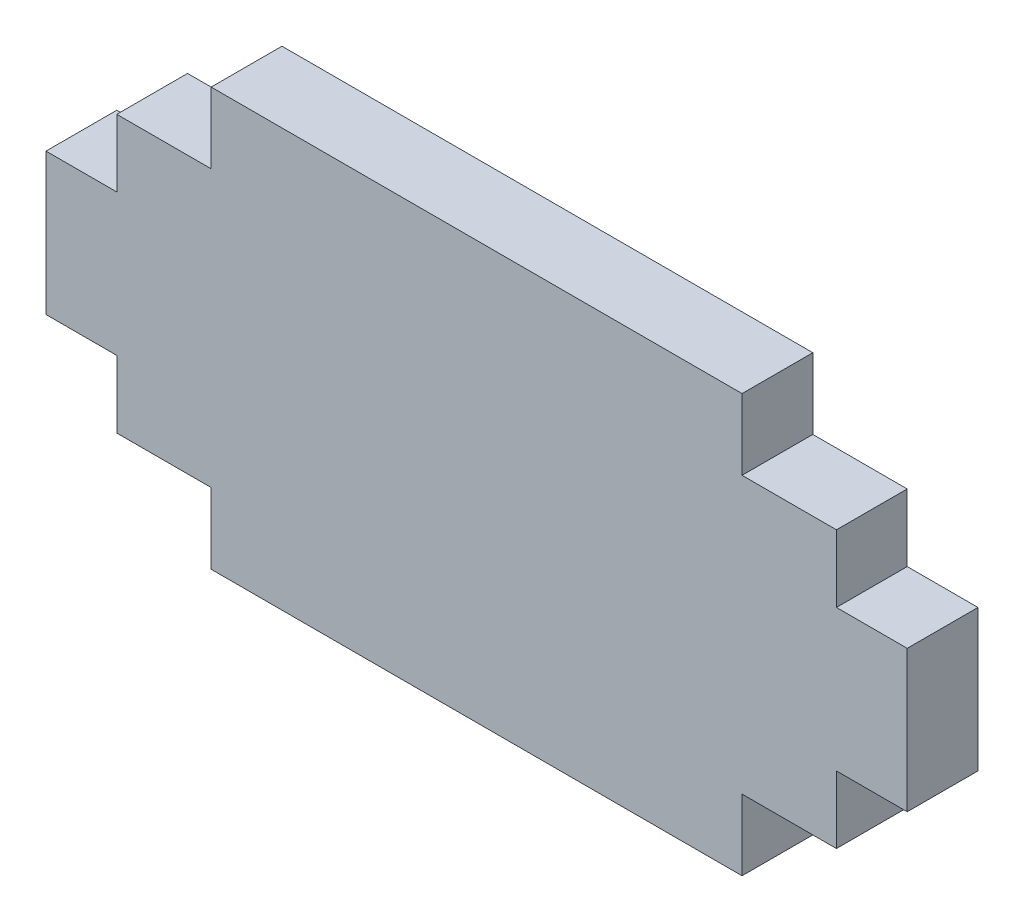
ISO-10303-21;
HEADER;
FILE_DESCRIPTION(('STEP AP214'),'2;1');
FILE_NAME('part.step','',(''),(''),'','','');
FILE_SCHEMA(('AUTOMOTIVE_DESIGN { 1 0 10303 214 1 1 1 1 }'));
ENDSEC;
DATA;
#1=APPLICATION_CONTEXT('core data for automotive mechanical design processes');
#2=APPLICATION_PROTOCOL_DEFINITION('international standard','automotive_design',2000,#1);
#3=PRODUCT_CONTEXT('',#1,'mechanical');
#4=PRODUCT('Part','Part','',(#3));
#5=PRODUCT_RELATED_PRODUCT_CATEGORY('part','',(#4));
#6=PRODUCT_DEFINITION_FORMATION('','',#4);
#7=PRODUCT_DEFINITION_CONTEXT('part definition',#1,'design');
#8=PRODUCT_DEFINITION('design','',#6,#7);
#9=PRODUCT_DEFINITION_SHAPE('','',#8);
#10=(LENGTH_UNIT() NAMED_UNIT(*) SI_UNIT(.MILLI.,.METRE.));
#11=(NAMED_UNIT(*) PLANE_ANGLE_UNIT() SI_UNIT($,.RADIAN.));
#12=(NAMED_UNIT(*) SI_UNIT($,.STERADIAN.) SOLID_ANGLE_UNIT());
#13=UNCERTAINTY_MEASURE_WITH_UNIT(LENGTH_MEASURE(1.E-05),#10,'distance_accuracy_value','');
#14=(GEOMETRIC_REPRESENTATION_CONTEXT(3) GLOBAL_UNCERTAINTY_ASSIGNED_CONTEXT((#13)) GLOBAL_UNIT_ASSIGNED_CONTEXT((#10,
#11,#12)) REPRESENTATION_CONTEXT('',''));
#15=CARTESIAN_POINT('',(0.,0.,0.));
#16=DIRECTION('',(0.,0.,1.));
#17=DIRECTION('',(1.,0.,0.));
#18=AXIS2_PLACEMENT_3D('',#15,#16,#17);
#19=CARTESIAN_POINT('',(0.,-3.,3.));
#20=DIRECTION('',(1.,0.,0.));
#21=DIRECTION('',(0.,0.,-1.));
#22=AXIS2_PLACEMENT_3D('',#19,#20,#21);
#23=PLANE('',#22);
#24=DIRECTION('',(0.,-1.,0.));
#25=VECTOR('',#24,1.);
#26=CARTESIAN_POINT('',(0.,-3.,0.));
#27=LINE('',#26,#25);
#28=CARTESIAN_POINT('',(0.,-3.,0.));
#29=VERTEX_POINT('',#28);
#30=CARTESIAN_POINT('',(0.,-5.85,0.));
#31=VERTEX_POINT('',#30);
#32=EDGE_CURVE('E216',#29,#31,#27,.T.);
#33=ORIENTED_EDGE('',*,*,#32,.T.);
#34=DIRECTION('',(0.,0.,-1.));
#35=VECTOR('',#34,1.);
#36=CARTESIAN_POINT('',(0.,-5.85,3.));
#37=LINE('',#36,#35);
#38=CARTESIAN_POINT('',(0.,-5.85,3.));
#39=VERTEX_POINT('',#38);
#40=EDGE_CURVE('E11',#39,#31,#37,.T.);
#41=ORIENTED_EDGE('',*,*,#40,.F.);
#42=DIRECTION('',(0.,-1.,0.));
#43=VECTOR('',#42,1.);
#44=CARTESIAN_POINT('',(0.,-3.,3.));
#45=LINE('',#44,#43);
#46=CARTESIAN_POINT('',(0.,-3.,3.));
#47=VERTEX_POINT('',#46);
#48=EDGE_CURVE('E254',#47,#39,#45,.T.);
#49=ORIENTED_EDGE('',*,*,#48,.F.);
#50=DIRECTION('',(0.,0.,-1.));
#51=VECTOR('',#50,1.);
#52=CARTESIAN_POINT('',(0.,-3.,3.));
#53=LINE('',#52,#51);
#54=EDGE_CURVE('E212',#47,#29,#53,.T.);
#55=ORIENTED_EDGE('',*,*,#54,.T.);
#56=EDGE_LOOP('',(#33,#41,#49,#55));
#57=FACE_BOUND('',#56,.T.);
#58=ADVANCED_FACE('F47',(#57),#23,.F.);
#59=CARTESIAN_POINT('',(0.,-5.85,3.));
#60=DIRECTION('',(0.,1.,0.));
#61=DIRECTION('',(0.,0.,1.));
#62=AXIS2_PLACEMENT_3D('',#59,#60,#61);
#63=PLANE('',#62);
#64=DIRECTION('',(1.,0.,0.));
#65=VECTOR('',#64,1.);
#66=CARTESIAN_POINT('',(0.,-5.85,0.));
#67=LINE('',#66,#65);
#68=CARTESIAN_POINT('',(4.,-5.85,0.));
#69=VERTEX_POINT('',#68);
#70=EDGE_CURVE('E219',#31,#69,#67,.T.);
#71=ORIENTED_EDGE('',*,*,#70,.T.);
#72=DIRECTION('',(0.,0.,-1.));
#73=VECTOR('',#72,1.);
#74=CARTESIAN_POINT('',(4.,-5.85,3.));
#75=LINE('',#74,#73);
#76=CARTESIAN_POINT('',(4.,-5.85,3.));
#77=VERTEX_POINT('',#76);
#78=EDGE_CURVE('E56',#77,#69,#75,.T.);
#79=ORIENTED_EDGE('',*,*,#78,.F.);
#80=DIRECTION('',(1.,0.,0.));
#81=VECTOR('',#80,1.);
#82=CARTESIAN_POINT('',(0.,-5.85,3.));
#83=LINE('',#82,#81);
#84=EDGE_CURVE('E143',#39,#77,#83,.T.);
#85=ORIENTED_EDGE('',*,*,#84,.F.);
#86=ORIENTED_EDGE('',*,*,#40,.T.);
#87=EDGE_LOOP('',(#71,#79,#85,#86));
#88=FACE_BOUND('',#87,.T.);
#89=ADVANCED_FACE('F372',(#88),#63,.F.);
#90=CARTESIAN_POINT('',(4.,-5.85,3.));
#91=DIRECTION('',(1.,0.,0.));
#92=DIRECTION('',(0.,0.,-1.));
#93=AXIS2_PLACEMENT_3D('',#90,#91,#92);
#94=PLANE('',#93);
#95=DIRECTION('',(0.,-1.,0.));
#96=VECTOR('',#95,1.);
#97=CARTESIAN_POINT('',(4.,-5.85,0.));
#98=LINE('',#97,#96);
#99=CARTESIAN_POINT('',(4.,-8.85,0.));
#100=VERTEX_POINT('',#99);
#101=EDGE_CURVE('E221',#69,#100,#98,.T.);
#102=ORIENTED_EDGE('',*,*,#101,.T.);
#103=DIRECTION('',(0.,0.,-1.));
#104=VECTOR('',#103,1.);
#105=CARTESIAN_POINT('',(4.,-8.85,3.));
#106=LINE('',#105,#104);
#107=CARTESIAN_POINT('',(4.,-8.85,3.));
#108=VERTEX_POINT('',#107);
#109=EDGE_CURVE('E297',#108,#100,#106,.T.);
#110=ORIENTED_EDGE('',*,*,#109,.F.);
#111=DIRECTION('',(0.,-1.,0.));
#112=VECTOR('',#111,1.);
#113=CARTESIAN_POINT('',(4.,-5.85,3.));
#114=LINE('',#113,#112);
#115=EDGE_CURVE('E305',#77,#108,#114,.T.);
#116=ORIENTED_EDGE('',*,*,#115,.F.);
#117=ORIENTED_EDGE('',*,*,#78,.T.);
#118=EDGE_LOOP('',(#102,#110,#116,#117));
#119=FACE_BOUND('',#118,.T.);
#120=ADVANCED_FACE('F303',(#119),#94,.F.);
#121=CARTESIAN_POINT('',(4.,-8.85,3.));
#122=DIRECTION('',(0.,1.,0.));
#123=DIRECTION('',(0.,0.,1.));
#124=AXIS2_PLACEMENT_3D('',#121,#122,#123);
#125=PLANE('',#124);
#126=DIRECTION('',(1.,0.,0.));
#127=VECTOR('',#126,1.);
#128=CARTESIAN_POINT('',(4.,-8.85,0.));
#129=LINE('',#128,#127);
#130=CARTESIAN_POINT('',(26.5,-8.85,0.));
#131=VERTEX_POINT('',#130);
#132=EDGE_CURVE('E223',#100,#131,#129,.T.);
#133=ORIENTED_EDGE('',*,*,#132,.T.);
#134=DIRECTION('',(0.,0.,-1.));
#135=VECTOR('',#134,1.);
#136=CARTESIAN_POINT('',(26.5,-8.85,3.));
#137=LINE('',#136,#135);
#138=CARTESIAN_POINT('',(26.5,-8.85,3.));
#139=VERTEX_POINT('',#138);
#140=EDGE_CURVE('E294',#139,#131,#137,.T.);
#141=ORIENTED_EDGE('',*,*,#140,.F.);
#142=DIRECTION('',(1.,0.,0.));
#143=VECTOR('',#142,1.);
#144=CARTESIAN_POINT('',(4.,-8.85,3.));
#145=LINE('',#144,#143);
#146=EDGE_CURVE('E323',#108,#139,#145,.T.);
#147=ORIENTED_EDGE('',*,*,#146,.F.);
#148=ORIENTED_EDGE('',*,*,#109,.T.);
#149=EDGE_LOOP('',(#133,#141,#147,#148));
#150=FACE_BOUND('',#149,.T.);
#151=ADVANCED_FACE('F314',(#150),#125,.F.);
#152=CARTESIAN_POINT('',(26.5,-8.85,3.));
#153=DIRECTION('',(-1.,0.,0.));
#154=DIRECTION('',(0.,0.,1.));
#155=AXIS2_PLACEMENT_3D('',#152,#153,#154);
#156=PLANE('',#155);
#157=DIRECTION('',(0.,1.,0.));
#158=VECTOR('',#157,1.);
#159=CARTESIAN_POINT('',(26.5,-8.85,0.));
#160=LINE('',#159,#158);
#161=CARTESIAN_POINT('',(26.5,-5.85,0.));
#162=VERTEX_POINT('',#161);
#163=EDGE_CURVE('E225',#131,#162,#160,.T.);
#164=ORIENTED_EDGE('',*,*,#163,.T.);
#165=DIRECTION('',(0.,0.,-1.));
#166=VECTOR('',#165,1.);
#167=CARTESIAN_POINT('',(26.5,-5.85,3.));
#168=LINE('',#167,#166);
#169=CARTESIAN_POINT('',(26.5,-5.85,3.));
#170=VERTEX_POINT('',#169);
#171=EDGE_CURVE('E291',#170,#162,#168,.T.);
#172=ORIENTED_EDGE('',*,*,#171,.F.);
#173=DIRECTION('',(0.,1.,0.));
#174=VECTOR('',#173,1.);
#175=CARTESIAN_POINT('',(26.5,-8.85,3.));
#176=LINE('',#175,#174);
#177=EDGE_CURVE('E320',#139,#170,#176,.T.);
#178=ORIENTED_EDGE('',*,*,#177,.F.);
#179=ORIENTED_EDGE('',*,*,#140,.T.);
#180=EDGE_LOOP('',(#164,#172,#178,#179));
#181=FACE_BOUND('',#180,.T.);
#182=ADVANCED_FACE('F318',(#181),#156,.F.);
#183=CARTESIAN_POINT('',(26.5,-5.85,3.));
#184=DIRECTION('',(0.,1.,0.));
#185=DIRECTION('',(0.,0.,1.));
#186=AXIS2_PLACEMENT_3D('',#183,#184,#185);
#187=PLANE('',#186);
#188=DIRECTION('',(1.,0.,0.));
#189=VECTOR('',#188,1.);
#190=CARTESIAN_POINT('',(26.5,-5.85,0.));
#191=LINE('',#190,#189);
#192=CARTESIAN_POINT('',(30.5,-5.85,0.));
#193=VERTEX_POINT('',#192);
#194=EDGE_CURVE('E227',#162,#193,#191,.T.);
#195=ORIENTED_EDGE('',*,*,#194,.T.);
#196=DIRECTION('',(0.,0.,-1.));
#197=VECTOR('',#196,1.);
#198=CARTESIAN_POINT('',(30.5,-5.85,3.));
#199=LINE('',#198,#197);
#200=CARTESIAN_POINT('',(30.5,-5.85,3.));
#201=VERTEX_POINT('',#200);
#202=EDGE_CURVE('E288',#201,#193,#199,.T.);
#203=ORIENTED_EDGE('',*,*,#202,.F.);
#204=DIRECTION('',(1.,0.,0.));
#205=VECTOR('',#204,1.);
#206=CARTESIAN_POINT('',(26.5,-5.85,3.));
#207=LINE('',#206,#205);
#208=EDGE_CURVE('E322',#170,#201,#207,.T.);
#209=ORIENTED_EDGE('',*,*,#208,.F.);
#210=ORIENTED_EDGE('',*,*,#171,.T.);
#211=EDGE_LOOP('',(#195,#203,#209,#210));
#212=FACE_BOUND('',#211,.T.);
#213=ADVANCED_FACE('F388',(#212),#187,.F.);
#214=CARTESIAN_POINT('',(30.5,-5.85,3.));
#215=DIRECTION('',(-1.,0.,0.));
#216=DIRECTION('',(0.,0.,1.));
#217=AXIS2_PLACEMENT_3D('',#214,#215,#216);
#218=PLANE('',#217);
#219=DIRECTION('',(0.,1.,0.));
#220=VECTOR('',#219,1.);
#221=CARTESIAN_POINT('',(30.5,-5.85,0.));
#222=LINE('',#221,#220);
#223=CARTESIAN_POINT('',(30.5,-3.,0.));
#224=VERTEX_POINT('',#223);
#225=EDGE_CURVE('E229',#193,#224,#222,.T.);
#226=ORIENTED_EDGE('',*,*,#225,.T.);
#227=DIRECTION('',(0.,0.,-1.));
#228=VECTOR('',#227,1.);
#229=CARTESIAN_POINT('',(30.5,-3.,3.));
#230=LINE('',#229,#228);
#231=CARTESIAN_POINT('',(30.5,-3.,3.));
#232=VERTEX_POINT('',#231);
#233=EDGE_CURVE('E285',#232,#224,#230,.T.);
#234=ORIENTED_EDGE('',*,*,#233,.F.);
#235=DIRECTION('',(0.,1.,0.));
#236=VECTOR('',#235,1.);
#237=CARTESIAN_POINT('',(30.5,-5.85,3.));
#238=LINE('',#237,#236);
#239=EDGE_CURVE('E325',#201,#232,#238,.T.);
#240=ORIENTED_EDGE('',*,*,#239,.F.);
#241=ORIENTED_EDGE('',*,*,#202,.T.);
#242=EDGE_LOOP('',(#226,#234,#240,#241));
#243=FACE_BOUND('',#242,.T.);
#244=ADVANCED_FACE('F392',(#243),#218,.F.);
#245=CARTESIAN_POINT('',(30.5,-3.,3.));
#246=DIRECTION('',(0.,1.,0.));
#247=DIRECTION('',(0.,0.,1.));
#248=AXIS2_PLACEMENT_3D('',#245,#246,#247);
#249=PLANE('',#248);
#250=DIRECTION('',(1.,0.,0.));
#251=VECTOR('',#250,1.);
#252=CARTESIAN_POINT('',(30.5,-3.,0.));
#253=LINE('',#252,#251);
#254=CARTESIAN_POINT('',(33.5,-3.,0.));
#255=VERTEX_POINT('',#254);
#256=EDGE_CURVE('E231',#224,#255,#253,.T.);
#257=ORIENTED_EDGE('',*,*,#256,.T.);
#258=DIRECTION('',(0.,0.,-1.));
#259=VECTOR('',#258,1.);
#260=CARTESIAN_POINT('',(33.5,-3.,3.));
#261=LINE('',#260,#259);
#262=CARTESIAN_POINT('',(33.5,-3.,3.));
#263=VERTEX_POINT('',#262);
#264=EDGE_CURVE('E282',#263,#255,#261,.T.);
#265=ORIENTED_EDGE('',*,*,#264,.F.);
#266=DIRECTION('',(1.,0.,0.));
#267=VECTOR('',#266,1.);
#268=CARTESIAN_POINT('',(30.5,-3.,3.));
#269=LINE('',#268,#267);
#270=EDGE_CURVE('E331',#232,#263,#269,.T.);
#271=ORIENTED_EDGE('',*,*,#270,.F.);
#272=ORIENTED_EDGE('',*,*,#233,.T.);
#273=EDGE_LOOP('',(#257,#265,#271,#272));
#274=FACE_BOUND('',#273,.T.);
#275=ADVANCED_FACE('F397',(#274),#249,.F.);
#276=CARTESIAN_POINT('',(33.5,-3.,3.));
#277=DIRECTION('',(-1.,0.,0.));
#278=DIRECTION('',(0.,0.,1.));
#279=AXIS2_PLACEMENT_3D('',#276,#277,#278);
#280=PLANE('',#279);
#281=DIRECTION('',(0.,1.,0.));
#282=VECTOR('',#281,1.);
#283=CARTESIAN_POINT('',(33.5,-3.,0.));
#284=LINE('',#283,#282);
#285=CARTESIAN_POINT('',(33.5,3.,0.));
#286=VERTEX_POINT('',#285);
#287=EDGE_CURVE('E233',#255,#286,#284,.T.);
#288=ORIENTED_EDGE('',*,*,#287,.T.);
#289=DIRECTION('',(0.,0.,-1.));
#290=VECTOR('',#289,1.);
#291=CARTESIAN_POINT('',(33.5,3.,3.));
#292=LINE('',#291,#290);
#293=CARTESIAN_POINT('',(33.5,3.,3.));
#294=VERTEX_POINT('',#293);
#295=EDGE_CURVE('E279',#294,#286,#292,.T.);
#296=ORIENTED_EDGE('',*,*,#295,.F.);
#297=DIRECTION('',(0.,1.,0.));
#298=VECTOR('',#297,1.);
#299=CARTESIAN_POINT('',(33.5,-3.,3.));
#300=LINE('',#299,#298);
#301=EDGE_CURVE('E333',#263,#294,#300,.T.);
#302=ORIENTED_EDGE('',*,*,#301,.F.);
#303=ORIENTED_EDGE('',*,*,#264,.T.);
#304=EDGE_LOOP('',(#288,#296,#302,#303));
#305=FACE_BOUND('',#304,.T.);
#306=ADVANCED_FACE('F402',(#305),#280,.F.);
#307=CARTESIAN_POINT('',(33.5,3.,3.));
#308=DIRECTION('',(0.,-1.,0.));
#309=DIRECTION('',(0.,0.,-1.));
#310=AXIS2_PLACEMENT_3D('',#307,#308,#309);
#311=PLANE('',#310);
#312=DIRECTION('',(-1.,0.,0.));
#313=VECTOR('',#312,1.);
#314=CARTESIAN_POINT('',(33.5,3.,0.));
#315=LINE('',#314,#313);
#316=CARTESIAN_POINT('',(30.5,3.,0.));
#317=VERTEX_POINT('',#316);
#318=EDGE_CURVE('E235',#286,#317,#315,.T.);
#319=ORIENTED_EDGE('',*,*,#318,.T.);
#320=DIRECTION('',(0.,0.,-1.));
#321=VECTOR('',#320,1.);
#322=CARTESIAN_POINT('',(30.5,3.,3.));
#323=LINE('',#322,#321);
#324=CARTESIAN_POINT('',(30.5,3.,3.));
#325=VERTEX_POINT('',#324);
#326=EDGE_CURVE('E276',#325,#317,#323,.T.);
#327=ORIENTED_EDGE('',*,*,#326,.F.);
#328=DIRECTION('',(-1.,0.,0.));
#329=VECTOR('',#328,1.);
#330=CARTESIAN_POINT('',(33.5,3.,3.));
#331=LINE('',#330,#329);
#332=EDGE_CURVE('E335',#294,#325,#331,.T.);
#333=ORIENTED_EDGE('',*,*,#332,.F.);
#334=ORIENTED_EDGE('',*,*,#295,.T.);
#335=EDGE_LOOP('',(#319,#327,#333,#334));
#336=FACE_BOUND('',#335,.T.);
#337=ADVANCED_FACE('F407',(#336),#311,.F.);
#338=CARTESIAN_POINT('',(30.5,3.,3.));
#339=DIRECTION('',(-1.,0.,0.));
#340=DIRECTION('',(0.,0.,1.));
#341=AXIS2_PLACEMENT_3D('',#338,#339,#340);
#342=PLANE('',#341);
#343=DIRECTION('',(0.,1.,0.));
#344=VECTOR('',#343,1.);
#345=CARTESIAN_POINT('',(30.5,3.,0.));
#346=LINE('',#345,#344);
#347=CARTESIAN_POINT('',(30.5,5.85,0.));
#348=VERTEX_POINT('',#347);
#349=EDGE_CURVE('E237',#317,#348,#346,.T.);
#350=ORIENTED_EDGE('',*,*,#349,.T.);
#351=DIRECTION('',(0.,0.,-1.));
#352=VECTOR('',#351,1.);
#353=CARTESIAN_POINT('',(30.5,5.85,3.));
#354=LINE('',#353,#352);
#355=CARTESIAN_POINT('',(30.5,5.85,3.));
#356=VERTEX_POINT('',#355);
#357=EDGE_CURVE('E273',#356,#348,#354,.T.);
#358=ORIENTED_EDGE('',*,*,#357,.F.);
#359=DIRECTION('',(0.,1.,0.));
#360=VECTOR('',#359,1.);
#361=CARTESIAN_POINT('',(30.5,3.,3.));
#362=LINE('',#361,#360);
#363=EDGE_CURVE('E337',#325,#356,#362,.T.);
#364=ORIENTED_EDGE('',*,*,#363,.F.);
#365=ORIENTED_EDGE('',*,*,#326,.T.);
#366=EDGE_LOOP('',(#350,#358,#364,#365));
#367=FACE_BOUND('',#366,.T.);
#368=ADVANCED_FACE('F412',(#367),#342,.F.);
#369=CARTESIAN_POINT('',(30.5,5.85,3.));
#370=DIRECTION('',(0.,-1.,0.));
#371=DIRECTION('',(0.,0.,-1.));
#372=AXIS2_PLACEMENT_3D('',#369,#370,#371);
#373=PLANE('',#372);
#374=DIRECTION('',(-1.,0.,0.));
#375=VECTOR('',#374,1.);
#376=CARTESIAN_POINT('',(30.5,5.85,0.));
#377=LINE('',#376,#375);
#378=CARTESIAN_POINT('',(26.5,5.85,0.));
#379=VERTEX_POINT('',#378);
#380=EDGE_CURVE('E239',#348,#379,#377,.T.);
#381=ORIENTED_EDGE('',*,*,#380,.T.);
#382=DIRECTION('',(0.,0.,-1.));
#383=VECTOR('',#382,1.);
#384=CARTESIAN_POINT('',(26.5,5.85,3.));
#385=LINE('',#384,#383);
#386=CARTESIAN_POINT('',(26.5,5.85,3.));
#387=VERTEX_POINT('',#386);
#388=EDGE_CURVE('E270',#387,#379,#385,.T.);
#389=ORIENTED_EDGE('',*,*,#388,.F.);
#390=DIRECTION('',(-1.,0.,0.));
#391=VECTOR('',#390,1.);
#392=CARTESIAN_POINT('',(30.5,5.85,3.));
#393=LINE('',#392,#391);
#394=EDGE_CURVE('E339',#356,#387,#393,.T.);
#395=ORIENTED_EDGE('',*,*,#394,.F.);
#396=ORIENTED_EDGE('',*,*,#357,.T.);
#397=EDGE_LOOP('',(#381,#389,#395,#396));
#398=FACE_BOUND('',#397,.T.);
#399=ADVANCED_FACE('F417',(#398),#373,.F.);
#400=CARTESIAN_POINT('',(26.5,5.85,3.));
#401=DIRECTION('',(-1.,0.,0.));
#402=DIRECTION('',(0.,0.,1.));
#403=AXIS2_PLACEMENT_3D('',#400,#401,#402);
#404=PLANE('',#403);
#405=DIRECTION('',(0.,1.,0.));
#406=VECTOR('',#405,1.);
#407=CARTESIAN_POINT('',(26.5,5.85,0.));
#408=LINE('',#407,#406);
#409=CARTESIAN_POINT('',(26.5,8.85,0.));
#410=VERTEX_POINT('',#409);
#411=EDGE_CURVE('E241',#379,#410,#408,.T.);
#412=ORIENTED_EDGE('',*,*,#411,.T.);
#413=DIRECTION('',(0.,0.,-1.));
#414=VECTOR('',#413,1.);
#415=CARTESIAN_POINT('',(26.5,8.85,3.));
#416=LINE('',#415,#414);
#417=CARTESIAN_POINT('',(26.5,8.85,3.));
#418=VERTEX_POINT('',#417);
#419=EDGE_CURVE('E267',#418,#410,#416,.T.);
#420=ORIENTED_EDGE('',*,*,#419,.F.);
#421=DIRECTION('',(0.,1.,0.));
#422=VECTOR('',#421,1.);
#423=CARTESIAN_POINT('',(26.5,5.85,3.));
#424=LINE('',#423,#422);
#425=EDGE_CURVE('E341',#387,#418,#424,.T.);
#426=ORIENTED_EDGE('',*,*,#425,.F.);
#427=ORIENTED_EDGE('',*,*,#388,.T.);
#428=EDGE_LOOP('',(#412,#420,#426,#427));
#429=FACE_BOUND('',#428,.T.);
#430=ADVANCED_FACE('F422',(#429),#404,.F.);
#431=CARTESIAN_POINT('',(26.5,8.85,3.));
#432=DIRECTION('',(0.,-1.,0.));
#433=DIRECTION('',(0.,0.,-1.));
#434=AXIS2_PLACEMENT_3D('',#431,#432,#433);
#435=PLANE('',#434);
#436=DIRECTION('',(-1.,0.,0.));
#437=VECTOR('',#436,1.);
#438=CARTESIAN_POINT('',(26.5,8.85,0.));
#439=LINE('',#438,#437);
#440=CARTESIAN_POINT('',(4.,8.85,0.));
#441=VERTEX_POINT('',#440);
#442=EDGE_CURVE('E243',#410,#441,#439,.T.);
#443=ORIENTED_EDGE('',*,*,#442,.T.);
#444=DIRECTION('',(0.,0.,-1.));
#445=VECTOR('',#444,1.);
#446=CARTESIAN_POINT('',(4.,8.85,3.));
#447=LINE('',#446,#445);
#448=CARTESIAN_POINT('',(4.,8.85,3.));
#449=VERTEX_POINT('',#448);
#450=EDGE_CURVE('E264',#449,#441,#447,.T.);
#451=ORIENTED_EDGE('',*,*,#450,.F.);
#452=DIRECTION('',(-1.,0.,0.));
#453=VECTOR('',#452,1.);
#454=CARTESIAN_POINT('',(26.5,8.85,3.));
#455=LINE('',#454,#453);
#456=EDGE_CURVE('E343',#418,#449,#455,.T.);
#457=ORIENTED_EDGE('',*,*,#456,.F.);
#458=ORIENTED_EDGE('',*,*,#419,.T.);
#459=EDGE_LOOP('',(#443,#451,#457,#458));
#460=FACE_BOUND('',#459,.T.);
#461=ADVANCED_FACE('F427',(#460),#435,.F.);
#462=CARTESIAN_POINT('',(4.,8.85,3.));
#463=DIRECTION('',(1.,0.,0.));
#464=DIRECTION('',(0.,0.,-1.));
#465=AXIS2_PLACEMENT_3D('',#462,#463,#464);
#466=PLANE('',#465);
#467=DIRECTION('',(0.,-1.,0.));
#468=VECTOR('',#467,1.);
#469=CARTESIAN_POINT('',(4.,8.85,0.));
#470=LINE('',#469,#468);
#471=CARTESIAN_POINT('',(4.,5.85,0.));
#472=VERTEX_POINT('',#471);
#473=EDGE_CURVE('E245',#441,#472,#470,.T.);
#474=ORIENTED_EDGE('',*,*,#473,.T.);
#475=DIRECTION('',(0.,0.,-1.));
#476=VECTOR('',#475,1.);
#477=CARTESIAN_POINT('',(4.,5.85,3.));
#478=LINE('',#477,#476);
#479=CARTESIAN_POINT('',(4.,5.85,3.));
#480=VERTEX_POINT('',#479);
#481=EDGE_CURVE('E261',#480,#472,#478,.T.);
#482=ORIENTED_EDGE('',*,*,#481,.F.);
#483=DIRECTION('',(0.,-1.,0.));
#484=VECTOR('',#483,1.);
#485=CARTESIAN_POINT('',(4.,8.85,3.));
#486=LINE('',#485,#484);
#487=EDGE_CURVE('E345',#449,#480,#486,.T.);
#488=ORIENTED_EDGE('',*,*,#487,.F.);
#489=ORIENTED_EDGE('',*,*,#450,.T.);
#490=EDGE_LOOP('',(#474,#482,#488,#489));
#491=FACE_BOUND('',#490,.T.);
#492=ADVANCED_FACE('F432',(#491),#466,.F.);
#493=CARTESIAN_POINT('',(4.,5.85,3.));
#494=DIRECTION('',(0.,-1.,0.));
#495=DIRECTION('',(0.,0.,-1.));
#496=AXIS2_PLACEMENT_3D('',#493,#494,#495);
#497=PLANE('',#496);
#498=DIRECTION('',(-1.,0.,0.));
#499=VECTOR('',#498,1.);
#500=CARTESIAN_POINT('',(4.,5.85,0.));
#501=LINE('',#500,#499);
#502=CARTESIAN_POINT('',(0.,5.85,0.));
#503=VERTEX_POINT('',#502);
#504=EDGE_CURVE('E247',#472,#503,#501,.T.);
#505=ORIENTED_EDGE('',*,*,#504,.T.);
#506=DIRECTION('',(0.,0.,-1.));
#507=VECTOR('',#506,1.);
#508=CARTESIAN_POINT('',(0.,5.85,3.));
#509=LINE('',#508,#507);
#510=CARTESIAN_POINT('',(0.,5.85,3.));
#511=VERTEX_POINT('',#510);
#512=EDGE_CURVE('E258',#511,#503,#509,.T.);
#513=ORIENTED_EDGE('',*,*,#512,.F.);
#514=DIRECTION('',(-1.,0.,0.));
#515=VECTOR('',#514,1.);
#516=CARTESIAN_POINT('',(4.,5.85,3.));
#517=LINE('',#516,#515);
#518=EDGE_CURVE('E347',#480,#511,#517,.T.);
#519=ORIENTED_EDGE('',*,*,#518,.F.);
#520=ORIENTED_EDGE('',*,*,#481,.T.);
#521=EDGE_LOOP('',(#505,#513,#519,#520));
#522=FACE_BOUND('',#521,.T.);
#523=ADVANCED_FACE('F353',(#522),#497,.F.);
#524=CARTESIAN_POINT('',(0.,5.85,3.));
#525=DIRECTION('',(1.,0.,0.));
#526=DIRECTION('',(0.,0.,-1.));
#527=AXIS2_PLACEMENT_3D('',#524,#525,#526);
#528=PLANE('',#527);
#529=DIRECTION('',(0.,-1.,0.));
#530=VECTOR('',#529,1.);
#531=CARTESIAN_POINT('',(0.,5.85,0.));
#532=LINE('',#531,#530);
#533=CARTESIAN_POINT('',(0.,3.,0.));
#534=VERTEX_POINT('',#533);
#535=EDGE_CURVE('E249',#503,#534,#532,.T.);
#536=ORIENTED_EDGE('',*,*,#535,.T.);
#537=DIRECTION('',(0.,0.,-1.));
#538=VECTOR('',#537,1.);
#539=CARTESIAN_POINT('',(0.,3.,3.));
#540=LINE('',#539,#538);
#541=CARTESIAN_POINT('',(0.,3.,3.));
#542=VERTEX_POINT('',#541);
#543=EDGE_CURVE('E207',#542,#534,#540,.T.);
#544=ORIENTED_EDGE('',*,*,#543,.F.);
#545=DIRECTION('',(0.,-1.,0.));
#546=VECTOR('',#545,1.);
#547=CARTESIAN_POINT('',(0.,5.85,3.));
#548=LINE('',#547,#546);
#549=EDGE_CURVE('E198',#511,#542,#548,.T.);
#550=ORIENTED_EDGE('',*,*,#549,.F.);
#551=ORIENTED_EDGE('',*,*,#512,.T.);
#552=EDGE_LOOP('',(#536,#544,#550,#551));
#553=FACE_BOUND('',#552,.T.);
#554=ADVANCED_FACE('F357',(#553),#528,.F.);
#555=CARTESIAN_POINT('',(0.,3.,3.));
#556=DIRECTION('',(0.,-1.,0.));
#557=DIRECTION('',(0.,0.,-1.));
#558=AXIS2_PLACEMENT_3D('',#555,#556,#557);
#559=PLANE('',#558);
#560=DIRECTION('',(-1.,0.,0.));
#561=VECTOR('',#560,1.);
#562=CARTESIAN_POINT('',(0.,3.,0.));
#563=LINE('',#562,#561);
#564=CARTESIAN_POINT('',(-3.,3.,0.));
#565=VERTEX_POINT('',#564);
#566=EDGE_CURVE('E206',#534,#565,#563,.T.);
#567=ORIENTED_EDGE('',*,*,#566,.T.);
#568=DIRECTION('',(0.,0.,-1.));
#569=VECTOR('',#568,1.);
#570=CARTESIAN_POINT('',(-3.,3.,3.));
#571=LINE('',#570,#569);
#572=CARTESIAN_POINT('',(-3.,3.,3.));
#573=VERTEX_POINT('',#572);
#574=EDGE_CURVE('E203',#573,#565,#571,.T.);
#575=ORIENTED_EDGE('',*,*,#574,.F.);
#576=DIRECTION('',(-1.,0.,0.));
#577=VECTOR('',#576,1.);
#578=CARTESIAN_POINT('',(0.,3.,3.));
#579=LINE('',#578,#577);
#580=EDGE_CURVE('E192',#542,#573,#579,.T.);
#581=ORIENTED_EDGE('',*,*,#580,.F.);
#582=ORIENTED_EDGE('',*,*,#543,.T.);
#583=EDGE_LOOP('',(#567,#575,#581,#582));
#584=FACE_BOUND('',#583,.T.);
#585=ADVANCED_FACE('F204',(#584),#559,.F.);
#586=CARTESIAN_POINT('',(-3.,3.,3.));
#587=DIRECTION('',(1.,0.,0.));
#588=DIRECTION('',(0.,0.,-1.));
#589=AXIS2_PLACEMENT_3D('',#586,#587,#588);
#590=PLANE('',#589);
#591=DIRECTION('',(0.,-1.,0.));
#592=VECTOR('',#591,1.);
#593=CARTESIAN_POINT('',(-3.,3.,0.));
#594=LINE('',#593,#592);
#595=CARTESIAN_POINT('',(-3.,-3.,0.));
#596=VERTEX_POINT('',#595);
#597=EDGE_CURVE('E129',#565,#596,#594,.T.);
#598=ORIENTED_EDGE('',*,*,#597,.T.);
#599=DIRECTION('',(0.,0.,-1.));
#600=VECTOR('',#599,1.);
#601=CARTESIAN_POINT('',(-3.,-3.,3.));
#602=LINE('',#601,#600);
#603=CARTESIAN_POINT('',(-3.,-3.,3.));
#604=VERTEX_POINT('',#603);
#605=EDGE_CURVE('E208',#604,#596,#602,.T.);
#606=ORIENTED_EDGE('',*,*,#605,.F.);
#607=DIRECTION('',(0.,-1.,0.));
#608=VECTOR('',#607,1.);
#609=CARTESIAN_POINT('',(-3.,3.,3.));
#610=LINE('',#609,#608);
#611=EDGE_CURVE('E196',#573,#604,#610,.T.);
#612=ORIENTED_EDGE('',*,*,#611,.F.);
#613=ORIENTED_EDGE('',*,*,#574,.T.);
#614=EDGE_LOOP('',(#598,#606,#612,#613));
#615=FACE_BOUND('',#614,.T.);
#616=ADVANCED_FACE('F210',(#615),#590,.F.);
#617=CARTESIAN_POINT('',(-3.,-3.,3.));
#618=DIRECTION('',(0.,1.,0.));
#619=DIRECTION('',(0.,0.,1.));
#620=AXIS2_PLACEMENT_3D('',#617,#618,#619);
#621=PLANE('',#620);
#622=DIRECTION('',(1.,0.,0.));
#623=VECTOR('',#622,1.);
#624=CARTESIAN_POINT('',(-3.,-3.,0.));
#625=LINE('',#624,#623);
#626=EDGE_CURVE('E135',#596,#29,#625,.T.);
#627=ORIENTED_EDGE('',*,*,#626,.T.);
#628=ORIENTED_EDGE('',*,*,#54,.F.);
#629=DIRECTION('',(1.,0.,0.));
#630=VECTOR('',#629,1.);
#631=CARTESIAN_POINT('',(-3.,-3.,3.));
#632=LINE('',#631,#630);
#633=EDGE_CURVE('E64',#604,#47,#632,.T.);
#634=ORIENTED_EDGE('',*,*,#633,.F.);
#635=ORIENTED_EDGE('',*,*,#605,.T.);
#636=EDGE_LOOP('',(#627,#628,#634,#635));
#637=FACE_BOUND('',#636,.T.);
#638=ADVANCED_FACE('F361',(#637),#621,.F.);
#639=CARTESIAN_POINT('',(0.,0.,3.));
#640=DIRECTION('',(0.,0.,1.));
#641=DIRECTION('',(1.,0.,0.));
#642=AXIS2_PLACEMENT_3D('',#639,#640,#641);
#643=PLANE('',#642);
#644=ORIENTED_EDGE('',*,*,#48,.T.);
#645=ORIENTED_EDGE('',*,*,#84,.T.);
#646=ORIENTED_EDGE('',*,*,#115,.T.);
#647=ORIENTED_EDGE('',*,*,#146,.T.);
#648=ORIENTED_EDGE('',*,*,#177,.T.);
#649=ORIENTED_EDGE('',*,*,#208,.T.);
#650=ORIENTED_EDGE('',*,*,#239,.T.);
#651=ORIENTED_EDGE('',*,*,#270,.T.);
#652=ORIENTED_EDGE('',*,*,#301,.T.);
#653=ORIENTED_EDGE('',*,*,#332,.T.);
#654=ORIENTED_EDGE('',*,*,#363,.T.);
#655=ORIENTED_EDGE('',*,*,#394,.T.);
#656=ORIENTED_EDGE('',*,*,#425,.T.);
#657=ORIENTED_EDGE('',*,*,#456,.T.);
#658=ORIENTED_EDGE('',*,*,#487,.T.);
#659=ORIENTED_EDGE('',*,*,#518,.T.);
#660=ORIENTED_EDGE('',*,*,#549,.T.);
#661=ORIENTED_EDGE('',*,*,#580,.T.);
#662=ORIENTED_EDGE('',*,*,#611,.T.);
#663=ORIENTED_EDGE('',*,*,#633,.T.);
#664=EDGE_LOOP('',(#644,#645,#646,#647,#648,#649,#650,#651,#652,#653,#654,#655,#656,#657,#658,
#659,#660,#661,#662,#663));
#665=FACE_BOUND('',#664,.T.);
#666=ADVANCED_FACE('F194',(#665),#643,.T.);
#667=CARTESIAN_POINT('',(0.,0.,0.));
#668=DIRECTION('',(0.,0.,1.));
#669=DIRECTION('',(1.,0.,0.));
#670=AXIS2_PLACEMENT_3D('',#667,#668,#669);
#671=PLANE('',#670);
#672=ORIENTED_EDGE('',*,*,#32,.F.);
#673=ORIENTED_EDGE('',*,*,#626,.F.);
#674=ORIENTED_EDGE('',*,*,#597,.F.);
#675=ORIENTED_EDGE('',*,*,#566,.F.);
#676=ORIENTED_EDGE('',*,*,#535,.F.);
#677=ORIENTED_EDGE('',*,*,#504,.F.);
#678=ORIENTED_EDGE('',*,*,#473,.F.);
#679=ORIENTED_EDGE('',*,*,#442,.F.);
#680=ORIENTED_EDGE('',*,*,#411,.F.);
#681=ORIENTED_EDGE('',*,*,#380,.F.);
#682=ORIENTED_EDGE('',*,*,#349,.F.);
#683=ORIENTED_EDGE('',*,*,#318,.F.);
#684=ORIENTED_EDGE('',*,*,#287,.F.);
#685=ORIENTED_EDGE('',*,*,#256,.F.);
#686=ORIENTED_EDGE('',*,*,#225,.F.);
#687=ORIENTED_EDGE('',*,*,#194,.F.);
#688=ORIENTED_EDGE('',*,*,#163,.F.);
#689=ORIENTED_EDGE('',*,*,#132,.F.);
#690=ORIENTED_EDGE('',*,*,#101,.F.);
#691=ORIENTED_EDGE('',*,*,#70,.F.);
#692=EDGE_LOOP('',(#672,#673,#674,#675,#676,#677,#678,#679,#680,#681,#682,#683,#684,#685,#686,
#687,#688,#689,#690,#691));
#693=FACE_BOUND('',#692,.T.);
#694=ADVANCED_FACE('F309',(#693),#671,.F.);
#695=CLOSED_SHELL('',(#58,#89,#120,#151,#182,#213,#244,#275,#306,#337,#368,#399,#430,#461,#492,
#523,#554,#585,#616,#638,#666,#694));
#696=MANIFOLD_SOLID_BREP('B2',#695);
#697=ADVANCED_BREP_SHAPE_REPRESENTATION('',(#18,#696),#14);
#698=SHAPE_DEFINITION_REPRESENTATION(#9,#697);
ENDSEC;
END-ISO-10303-21;
